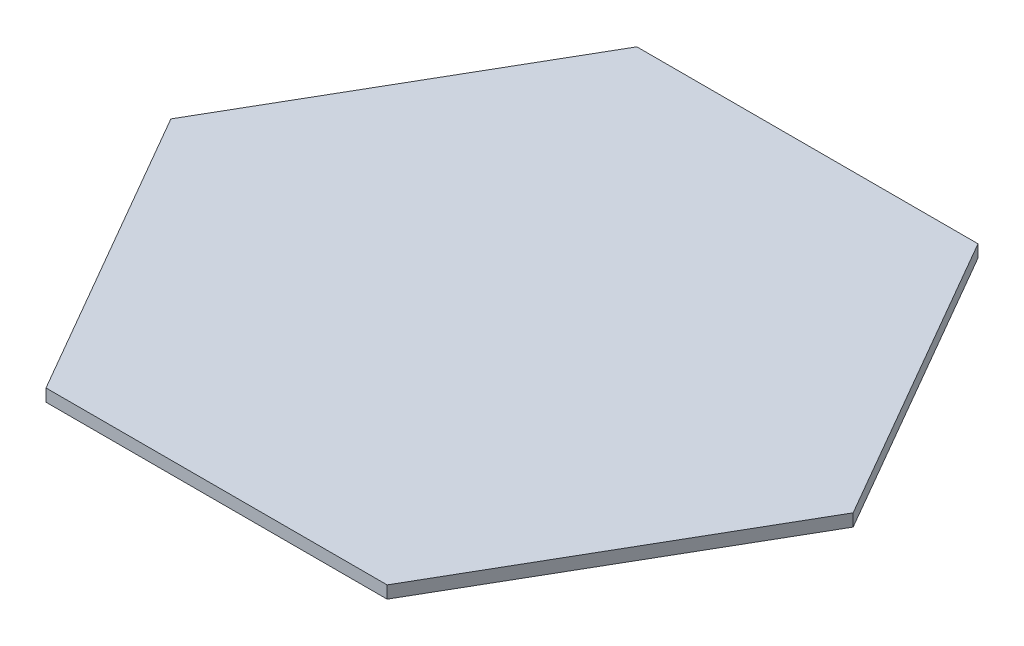
ISO-10303-21;
HEADER;
FILE_DESCRIPTION(('STEP AP214'),'2;1');
FILE_NAME('part.step','',(''),(''),'','','');
FILE_SCHEMA(('AUTOMOTIVE_DESIGN { 1 0 10303 214 1 1 1 1 }'));
ENDSEC;
DATA;
#1=APPLICATION_CONTEXT('core data for automotive mechanical design processes');
#2=APPLICATION_PROTOCOL_DEFINITION('international standard','automotive_design',2000,#1);
#3=PRODUCT_CONTEXT('',#1,'mechanical');
#4=PRODUCT('Part','Part','',(#3));
#5=PRODUCT_RELATED_PRODUCT_CATEGORY('part','',(#4));
#6=PRODUCT_DEFINITION_FORMATION('','',#4);
#7=PRODUCT_DEFINITION_CONTEXT('part definition',#1,'design');
#8=PRODUCT_DEFINITION('design','',#6,#7);
#9=PRODUCT_DEFINITION_SHAPE('','',#8);
#10=(LENGTH_UNIT() NAMED_UNIT(*) SI_UNIT(.MILLI.,.METRE.));
#11=(NAMED_UNIT(*) PLANE_ANGLE_UNIT() SI_UNIT($,.RADIAN.));
#12=(NAMED_UNIT(*) SI_UNIT($,.STERADIAN.) SOLID_ANGLE_UNIT());
#13=UNCERTAINTY_MEASURE_WITH_UNIT(LENGTH_MEASURE(1.E-05),#10,'distance_accuracy_value','');
#14=(GEOMETRIC_REPRESENTATION_CONTEXT(3) GLOBAL_UNCERTAINTY_ASSIGNED_CONTEXT((#13)) GLOBAL_UNIT_ASSIGNED_CONTEXT((#10,
#11,#12)) REPRESENTATION_CONTEXT('',''));
#15=CARTESIAN_POINT('',(0.,0.,0.));
#16=DIRECTION('',(0.,0.,1.));
#17=DIRECTION('',(1.,0.,0.));
#18=AXIS2_PLACEMENT_3D('',#15,#16,#17);
#19=CARTESIAN_POINT('',(68.9433756729741,5.,119.413429510899));
#20=DIRECTION('',(-0.866025403784439,0.,-0.5));
#21=DIRECTION('',(-0.5,0.,0.866025403784439));
#22=AXIS2_PLACEMENT_3D('',#19,#20,#21);
#23=PLANE('',#22);
#24=DIRECTION('',(0.5,0.,-0.866025403784439));
#25=VECTOR('',#24,1.);
#26=CARTESIAN_POINT('',(68.9433756729741,0.,119.413429510899));
#27=LINE('',#26,#25);
#28=CARTESIAN_POINT('',(68.9433756729741,0.,119.413429510899));
#29=VERTEX_POINT('',#28);
#30=CARTESIAN_POINT('',(137.886751345948,0.,0.));
#31=VERTEX_POINT('',#30);
#32=EDGE_CURVE('E126',#29,#31,#27,.T.);
#33=ORIENTED_EDGE('',*,*,#32,.T.);
#34=DIRECTION('',(0.,-1.,0.));
#35=VECTOR('',#34,1.);
#36=CARTESIAN_POINT('',(137.886751345948,5.,0.));
#37=LINE('',#36,#35);
#38=CARTESIAN_POINT('',(137.886751345948,5.,0.));
#39=VERTEX_POINT('',#38);
#40=EDGE_CURVE('E11',#39,#31,#37,.T.);
#41=ORIENTED_EDGE('',*,*,#40,.F.);
#42=DIRECTION('',(0.5,0.,-0.866025403784439));
#43=VECTOR('',#42,1.);
#44=CARTESIAN_POINT('',(68.9433756729741,5.,119.413429510899));
#45=LINE('',#44,#43);
#46=CARTESIAN_POINT('',(68.9433756729741,5.,119.413429510899));
#47=VERTEX_POINT('',#46);
#48=EDGE_CURVE('E136',#47,#39,#45,.T.);
#49=ORIENTED_EDGE('',*,*,#48,.F.);
#50=DIRECTION('',(0.,-1.,0.));
#51=VECTOR('',#50,1.);
#52=CARTESIAN_POINT('',(68.9433756729741,5.,119.413429510899));
#53=LINE('',#52,#51);
#54=EDGE_CURVE('E122',#47,#29,#53,.T.);
#55=ORIENTED_EDGE('',*,*,#54,.T.);
#56=EDGE_LOOP('',(#33,#41,#49,#55));
#57=FACE_BOUND('',#56,.T.);
#58=ADVANCED_FACE('F42',(#57),#23,.F.);
#59=CARTESIAN_POINT('',(137.886751345948,5.,0.));
#60=DIRECTION('',(-0.866025403784439,0.,0.5));
#61=DIRECTION('',(0.5,0.,0.866025403784439));
#62=AXIS2_PLACEMENT_3D('',#59,#60,#61);
#63=PLANE('',#62);
#64=DIRECTION('',(-0.5,0.,-0.866025403784439));
#65=VECTOR('',#64,1.);
#66=CARTESIAN_POINT('',(137.886751345948,0.,0.));
#67=LINE('',#66,#65);
#68=CARTESIAN_POINT('',(68.9433756729741,0.,-119.413429510899));
#69=VERTEX_POINT('',#68);
#70=EDGE_CURVE('E129',#31,#69,#67,.T.);
#71=ORIENTED_EDGE('',*,*,#70,.T.);
#72=DIRECTION('',(0.,-1.,0.));
#73=VECTOR('',#72,1.);
#74=CARTESIAN_POINT('',(68.9433756729741,5.,-119.413429510899));
#75=LINE('',#74,#73);
#76=CARTESIAN_POINT('',(68.9433756729741,5.,-119.413429510899));
#77=VERTEX_POINT('',#76);
#78=EDGE_CURVE('E50',#77,#69,#75,.T.);
#79=ORIENTED_EDGE('',*,*,#78,.F.);
#80=DIRECTION('',(-0.5,0.,-0.866025403784439));
#81=VECTOR('',#80,1.);
#82=CARTESIAN_POINT('',(137.886751345948,5.,0.));
#83=LINE('',#82,#81);
#84=EDGE_CURVE('E95',#39,#77,#83,.T.);
#85=ORIENTED_EDGE('',*,*,#84,.F.);
#86=ORIENTED_EDGE('',*,*,#40,.T.);
#87=EDGE_LOOP('',(#71,#79,#85,#86));
#88=FACE_BOUND('',#87,.T.);
#89=ADVANCED_FACE('F160',(#88),#63,.F.);
#90=CARTESIAN_POINT('',(68.9433756729741,5.,-119.413429510899));
#91=DIRECTION('',(0.,0.,1.));
#92=DIRECTION('',(1.,0.,0.));
#93=AXIS2_PLACEMENT_3D('',#90,#91,#92);
#94=PLANE('',#93);
#95=DIRECTION('',(-1.,0.,0.));
#96=VECTOR('',#95,1.);
#97=CARTESIAN_POINT('',(68.9433756729741,0.,-119.413429510899));
#98=LINE('',#97,#96);
#99=CARTESIAN_POINT('',(-68.9433756729741,0.,-119.413429510899));
#100=VERTEX_POINT('',#99);
#101=EDGE_CURVE('E131',#69,#100,#98,.T.);
#102=ORIENTED_EDGE('',*,*,#101,.T.);
#103=DIRECTION('',(0.,-1.,0.));
#104=VECTOR('',#103,1.);
#105=CARTESIAN_POINT('',(-68.9433756729741,5.,-119.413429510899));
#106=LINE('',#105,#104);
#107=CARTESIAN_POINT('',(-68.9433756729741,5.,-119.413429510899));
#108=VERTEX_POINT('',#107);
#109=EDGE_CURVE('E117',#108,#100,#106,.T.);
#110=ORIENTED_EDGE('',*,*,#109,.F.);
#111=DIRECTION('',(-1.,0.,0.));
#112=VECTOR('',#111,1.);
#113=CARTESIAN_POINT('',(68.9433756729741,5.,-119.413429510899));
#114=LINE('',#113,#112);
#115=EDGE_CURVE('E108',#77,#108,#114,.T.);
#116=ORIENTED_EDGE('',*,*,#115,.F.);
#117=ORIENTED_EDGE('',*,*,#78,.T.);
#118=EDGE_LOOP('',(#102,#110,#116,#117));
#119=FACE_BOUND('',#118,.T.);
#120=ADVANCED_FACE('F142',(#119),#94,.F.);
#121=CARTESIAN_POINT('',(-68.9433756729741,5.,-119.413429510899));
#122=DIRECTION('',(0.866025403784439,0.,0.5));
#123=DIRECTION('',(0.5,0.,-0.866025403784439));
#124=AXIS2_PLACEMENT_3D('',#121,#122,#123);
#125=PLANE('',#124);
#126=DIRECTION('',(-0.5,0.,0.866025403784439));
#127=VECTOR('',#126,1.);
#128=CARTESIAN_POINT('',(-68.9433756729741,0.,-119.413429510899));
#129=LINE('',#128,#127);
#130=CARTESIAN_POINT('',(-137.886751345948,0.,0.));
#131=VERTEX_POINT('',#130);
#132=EDGE_CURVE('E116',#100,#131,#129,.T.);
#133=ORIENTED_EDGE('',*,*,#132,.T.);
#134=DIRECTION('',(0.,-1.,0.));
#135=VECTOR('',#134,1.);
#136=CARTESIAN_POINT('',(-137.886751345948,5.,0.));
#137=LINE('',#136,#135);
#138=CARTESIAN_POINT('',(-137.886751345948,5.,0.));
#139=VERTEX_POINT('',#138);
#140=EDGE_CURVE('E113',#139,#131,#137,.T.);
#141=ORIENTED_EDGE('',*,*,#140,.F.);
#142=DIRECTION('',(-0.5,0.,0.866025403784439));
#143=VECTOR('',#142,1.);
#144=CARTESIAN_POINT('',(-68.9433756729741,5.,-119.413429510899));
#145=LINE('',#144,#143);
#146=EDGE_CURVE('E102',#108,#139,#145,.T.);
#147=ORIENTED_EDGE('',*,*,#146,.F.);
#148=ORIENTED_EDGE('',*,*,#109,.T.);
#149=EDGE_LOOP('',(#133,#141,#147,#148));
#150=FACE_BOUND('',#149,.T.);
#151=ADVANCED_FACE('F114',(#150),#125,.F.);
#152=CARTESIAN_POINT('',(-137.886751345948,5.,0.));
#153=DIRECTION('',(0.866025403784439,0.,-0.5));
#154=DIRECTION('',(-0.5,0.,-0.866025403784439));
#155=AXIS2_PLACEMENT_3D('',#152,#153,#154);
#156=PLANE('',#155);
#157=DIRECTION('',(0.5,0.,0.866025403784439));
#158=VECTOR('',#157,1.);
#159=CARTESIAN_POINT('',(-137.886751345948,0.,0.));
#160=LINE('',#159,#158);
#161=CARTESIAN_POINT('',(-68.9433756729741,0.,119.413429510899));
#162=VERTEX_POINT('',#161);
#163=EDGE_CURVE('E81',#131,#162,#160,.T.);
#164=ORIENTED_EDGE('',*,*,#163,.T.);
#165=DIRECTION('',(0.,-1.,0.));
#166=VECTOR('',#165,1.);
#167=CARTESIAN_POINT('',(-68.9433756729741,5.,119.413429510899));
#168=LINE('',#167,#166);
#169=CARTESIAN_POINT('',(-68.9433756729741,5.,119.413429510899));
#170=VERTEX_POINT('',#169);
#171=EDGE_CURVE('E118',#170,#162,#168,.T.);
#172=ORIENTED_EDGE('',*,*,#171,.F.);
#173=DIRECTION('',(0.5,0.,0.866025403784439));
#174=VECTOR('',#173,1.);
#175=CARTESIAN_POINT('',(-137.886751345948,5.,0.));
#176=LINE('',#175,#174);
#177=EDGE_CURVE('E106',#139,#170,#176,.T.);
#178=ORIENTED_EDGE('',*,*,#177,.F.);
#179=ORIENTED_EDGE('',*,*,#140,.T.);
#180=EDGE_LOOP('',(#164,#172,#178,#179));
#181=FACE_BOUND('',#180,.T.);
#182=ADVANCED_FACE('F120',(#181),#156,.F.);
#183=CARTESIAN_POINT('',(-68.9433756729741,5.,119.413429510899));
#184=DIRECTION('',(0.,0.,-1.));
#185=DIRECTION('',(-1.,0.,0.));
#186=AXIS2_PLACEMENT_3D('',#183,#184,#185);
#187=PLANE('',#186);
#188=DIRECTION('',(1.,0.,0.));
#189=VECTOR('',#188,1.);
#190=CARTESIAN_POINT('',(-68.9433756729741,0.,119.413429510899));
#191=LINE('',#190,#189);
#192=EDGE_CURVE('E87',#162,#29,#191,.T.);
#193=ORIENTED_EDGE('',*,*,#192,.T.);
#194=ORIENTED_EDGE('',*,*,#54,.F.);
#195=DIRECTION('',(1.,0.,0.));
#196=VECTOR('',#195,1.);
#197=CARTESIAN_POINT('',(-68.9433756729741,5.,119.413429510899));
#198=LINE('',#197,#196);
#199=EDGE_CURVE('E58',#170,#47,#198,.T.);
#200=ORIENTED_EDGE('',*,*,#199,.F.);
#201=ORIENTED_EDGE('',*,*,#171,.T.);
#202=EDGE_LOOP('',(#193,#194,#200,#201));
#203=FACE_BOUND('',#202,.T.);
#204=ADVANCED_FACE('F149',(#203),#187,.F.);
#205=CARTESIAN_POINT('',(0.,5.,0.));
#206=DIRECTION('',(0.,1.,0.));
#207=DIRECTION('',(0.,0.,1.));
#208=AXIS2_PLACEMENT_3D('',#205,#206,#207);
#209=PLANE('',#208);
#210=ORIENTED_EDGE('',*,*,#48,.T.);
#211=ORIENTED_EDGE('',*,*,#84,.T.);
#212=ORIENTED_EDGE('',*,*,#115,.T.);
#213=ORIENTED_EDGE('',*,*,#146,.T.);
#214=ORIENTED_EDGE('',*,*,#177,.T.);
#215=ORIENTED_EDGE('',*,*,#199,.T.);
#216=EDGE_LOOP('',(#210,#211,#212,#213,#214,#215));
#217=FACE_BOUND('',#216,.T.);
#218=ADVANCED_FACE('F104',(#217),#209,.T.);
#219=CARTESIAN_POINT('',(0.,0.,0.));
#220=DIRECTION('',(0.,1.,0.));
#221=DIRECTION('',(0.,0.,1.));
#222=AXIS2_PLACEMENT_3D('',#219,#220,#221);
#223=PLANE('',#222);
#224=ORIENTED_EDGE('',*,*,#32,.F.);
#225=ORIENTED_EDGE('',*,*,#192,.F.);
#226=ORIENTED_EDGE('',*,*,#163,.F.);
#227=ORIENTED_EDGE('',*,*,#132,.F.);
#228=ORIENTED_EDGE('',*,*,#101,.F.);
#229=ORIENTED_EDGE('',*,*,#70,.F.);
#230=EDGE_LOOP('',(#224,#225,#226,#227,#228,#229));
#231=FACE_BOUND('',#230,.T.);
#232=ADVANCED_FACE('F145',(#231),#223,.F.);
#233=CLOSED_SHELL('',(#58,#89,#120,#151,#182,#204,#218,#232));
#234=MANIFOLD_SOLID_BREP('B2',#233);
#235=ADVANCED_BREP_SHAPE_REPRESENTATION('',(#18,#234),#14);
#236=SHAPE_DEFINITION_REPRESENTATION(#9,#235);
ENDSEC;
END-ISO-10303-21;
